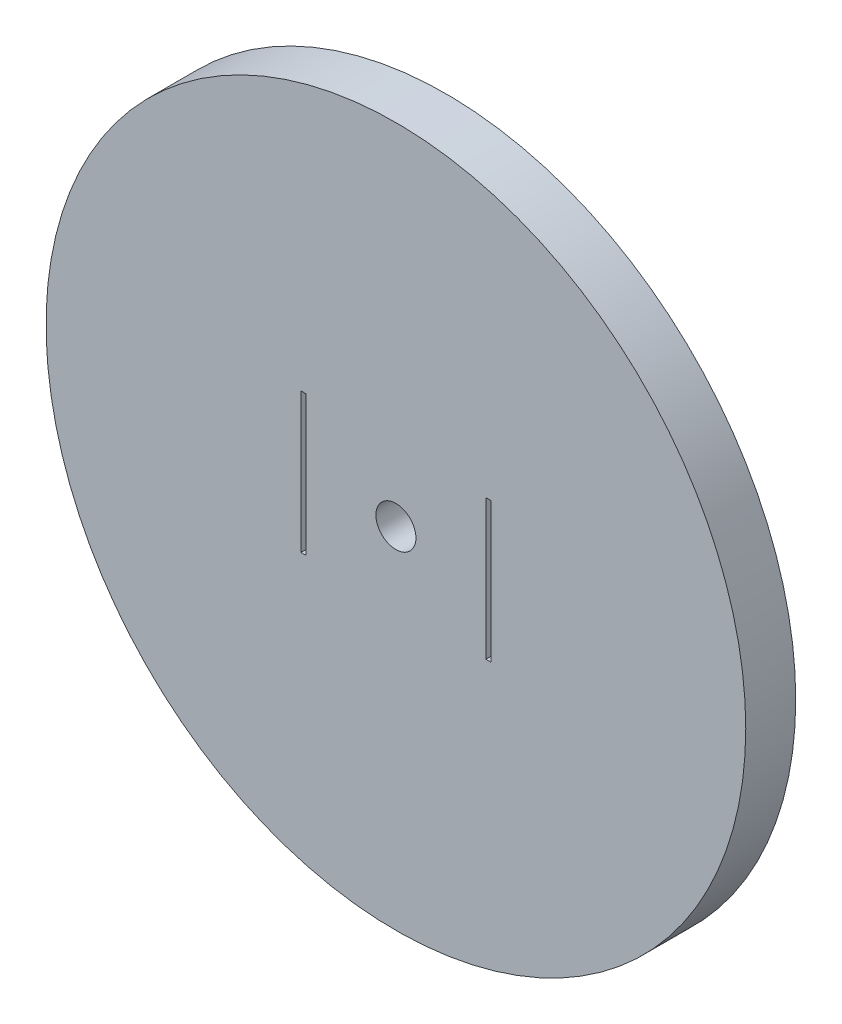
ISO-10303-21;
HEADER;
FILE_DESCRIPTION(('STEP AP214'),'2;1');
FILE_NAME('part.step','',(''),(''),'','','');
FILE_SCHEMA(('AUTOMOTIVE_DESIGN { 1 0 10303 214 1 1 1 1 }'));
ENDSEC;
DATA;
#1=APPLICATION_CONTEXT('core data for automotive mechanical design processes');
#2=APPLICATION_PROTOCOL_DEFINITION('international standard','automotive_design',2000,#1);
#3=PRODUCT_CONTEXT('',#1,'mechanical');
#4=PRODUCT('Part','Part','',(#3));
#5=PRODUCT_RELATED_PRODUCT_CATEGORY('part','',(#4));
#6=PRODUCT_DEFINITION_FORMATION('','',#4);
#7=PRODUCT_DEFINITION_CONTEXT('part definition',#1,'design');
#8=PRODUCT_DEFINITION('design','',#6,#7);
#9=PRODUCT_DEFINITION_SHAPE('','',#8);
#10=(LENGTH_UNIT() NAMED_UNIT(*) SI_UNIT(.MILLI.,.METRE.));
#11=(NAMED_UNIT(*) PLANE_ANGLE_UNIT() SI_UNIT($,.RADIAN.));
#12=(NAMED_UNIT(*) SI_UNIT($,.STERADIAN.) SOLID_ANGLE_UNIT());
#13=UNCERTAINTY_MEASURE_WITH_UNIT(LENGTH_MEASURE(1.E-05),#10,'distance_accuracy_value','');
#14=(GEOMETRIC_REPRESENTATION_CONTEXT(3) GLOBAL_UNCERTAINTY_ASSIGNED_CONTEXT((#13)) GLOBAL_UNIT_ASSIGNED_CONTEXT((#10,
#11,#12)) REPRESENTATION_CONTEXT('',''));
#15=CARTESIAN_POINT('',(0.,0.,0.));
#16=DIRECTION('',(0.,0.,1.));
#17=DIRECTION('',(1.,0.,0.));
#18=AXIS2_PLACEMENT_3D('',#15,#16,#17);
#19=CARTESIAN_POINT('',(0.,0.,5.));
#20=DIRECTION('',(0.,0.,1.));
#21=DIRECTION('',(1.,0.,0.));
#22=AXIS2_PLACEMENT_3D('',#19,#20,#21);
#23=PLANE('',#22);
#24=CARTESIAN_POINT('',(0.,0.,5.));
#25=DIRECTION('',(0.,0.,1.));
#26=DIRECTION('',(1.,0.,0.));
#27=AXIS2_PLACEMENT_3D('',#24,#25,#26);
#28=CIRCLE('',#27,35.);
#29=CARTESIAN_POINT('',(35.,0.,5.));
#30=VERTEX_POINT('',#29);
#31=EDGE_CURVE('E42',#30,#30,#28,.T.);
#32=ORIENTED_EDGE('',*,*,#31,.T.);
#33=EDGE_LOOP('',(#32));
#34=FACE_BOUND('',#33,.T.);
#35=CARTESIAN_POINT('',(0.,0.,5.));
#36=DIRECTION('',(0.,0.,1.));
#37=DIRECTION('',(1.,0.,0.));
#38=AXIS2_PLACEMENT_3D('',#35,#36,#37);
#39=CIRCLE('',#38,2.);
#40=CARTESIAN_POINT('',(2.,0.,5.));
#41=VERTEX_POINT('',#40);
#42=EDGE_CURVE('E168',#41,#41,#39,.T.);
#43=ORIENTED_EDGE('',*,*,#42,.F.);
#44=EDGE_LOOP('',(#43));
#45=FACE_BOUND('',#44,.T.);
#46=DIRECTION('',(1.,0.,0.));
#47=VECTOR('',#46,1.);
#48=CARTESIAN_POINT('',(-9.5,-7.,5.));
#49=LINE('',#48,#47);
#50=CARTESIAN_POINT('',(-9.5,-7.,5.));
#51=VERTEX_POINT('',#50);
#52=CARTESIAN_POINT('',(-9.,-7.,5.));
#53=VERTEX_POINT('',#52);
#54=EDGE_CURVE('E139',#51,#53,#49,.T.);
#55=ORIENTED_EDGE('',*,*,#54,.F.);
#56=DIRECTION('',(0.,-1.,0.));
#57=VECTOR('',#56,1.);
#58=CARTESIAN_POINT('',(-9.5,7.,5.));
#59=LINE('',#58,#57);
#60=CARTESIAN_POINT('',(-9.5,7.,5.));
#61=VERTEX_POINT('',#60);
#62=EDGE_CURVE('E137',#61,#51,#59,.T.);
#63=ORIENTED_EDGE('',*,*,#62,.F.);
#64=DIRECTION('',(-1.,0.,0.));
#65=VECTOR('',#64,1.);
#66=CARTESIAN_POINT('',(-9.5,7.,5.));
#67=LINE('',#66,#65);
#68=CARTESIAN_POINT('',(-9.,7.,5.));
#69=VERTEX_POINT('',#68);
#70=EDGE_CURVE('E145',#69,#61,#67,.T.);
#71=ORIENTED_EDGE('',*,*,#70,.F.);
#72=DIRECTION('',(0.,1.,0.));
#73=VECTOR('',#72,1.);
#74=CARTESIAN_POINT('',(-9.,7.,5.));
#75=LINE('',#74,#73);
#76=EDGE_CURVE('E142',#53,#69,#75,.T.);
#77=ORIENTED_EDGE('',*,*,#76,.F.);
#78=EDGE_LOOP('',(#55,#63,#71,#77));
#79=FACE_BOUND('',#78,.T.);
#80=DIRECTION('',(0.,-1.,0.));
#81=VECTOR('',#80,1.);
#82=CARTESIAN_POINT('',(9.,7.,5.));
#83=LINE('',#82,#81);
#84=CARTESIAN_POINT('',(9.,7.,5.));
#85=VERTEX_POINT('',#84);
#86=CARTESIAN_POINT('',(9.,-7.,5.));
#87=VERTEX_POINT('',#86);
#88=EDGE_CURVE('E108',#85,#87,#83,.T.);
#89=ORIENTED_EDGE('',*,*,#88,.F.);
#90=DIRECTION('',(-1.,0.,0.));
#91=VECTOR('',#90,1.);
#92=CARTESIAN_POINT('',(9.5,7.,5.));
#93=LINE('',#92,#91);
#94=CARTESIAN_POINT('',(9.5,7.,5.));
#95=VERTEX_POINT('',#94);
#96=EDGE_CURVE('E100',#95,#85,#93,.T.);
#97=ORIENTED_EDGE('',*,*,#96,.F.);
#98=DIRECTION('',(0.,1.,0.));
#99=VECTOR('',#98,1.);
#100=CARTESIAN_POINT('',(9.5,7.,5.));
#101=LINE('',#100,#99);
#102=CARTESIAN_POINT('',(9.5,-7.,5.));
#103=VERTEX_POINT('',#102);
#104=EDGE_CURVE('E122',#103,#95,#101,.T.);
#105=ORIENTED_EDGE('',*,*,#104,.F.);
#106=DIRECTION('',(1.,0.,0.));
#107=VECTOR('',#106,1.);
#108=CARTESIAN_POINT('',(9.5,-7.,5.));
#109=LINE('',#108,#107);
#110=EDGE_CURVE('E120',#87,#103,#109,.T.);
#111=ORIENTED_EDGE('',*,*,#110,.F.);
#112=EDGE_LOOP('',(#89,#97,#105,#111));
#113=FACE_BOUND('',#112,.T.);
#114=ADVANCED_FACE('F33',(#34,#45,#79,#113),#23,.T.);
#115=CARTESIAN_POINT('',(0.,0.,0.));
#116=DIRECTION('',(0.,0.,1.));
#117=DIRECTION('',(1.,0.,0.));
#118=AXIS2_PLACEMENT_3D('',#115,#116,#117);
#119=PLANE('',#118);
#120=CARTESIAN_POINT('',(-28.,0.,0.));
#121=DIRECTION('',(0.,0.,-1.));
#122=DIRECTION('',(-1.,0.,0.));
#123=AXIS2_PLACEMENT_3D('',#120,#121,#122);
#124=CIRCLE('',#123,4.34999999999999);
#125=CARTESIAN_POINT('',(-32.35,0.,0.));
#126=VERTEX_POINT('',#125);
#127=EDGE_CURVE('E11',#126,#126,#124,.T.);
#128=ORIENTED_EDGE('',*,*,#127,.F.);
#129=EDGE_LOOP('',(#128));
#130=FACE_BOUND('',#129,.T.);
#131=DIRECTION('',(0.,-1.,0.));
#132=VECTOR('',#131,1.);
#133=CARTESIAN_POINT('',(-9.5,7.,0.));
#134=LINE('',#133,#132);
#135=CARTESIAN_POINT('',(-9.5,7.,0.));
#136=VERTEX_POINT('',#135);
#137=CARTESIAN_POINT('',(-9.5,-7.,0.));
#138=VERTEX_POINT('',#137);
#139=EDGE_CURVE('E116',#136,#138,#134,.T.);
#140=ORIENTED_EDGE('',*,*,#139,.T.);
#141=DIRECTION('',(1.,0.,0.));
#142=VECTOR('',#141,1.);
#143=CARTESIAN_POINT('',(-9.5,-7.,0.));
#144=LINE('',#143,#142);
#145=CARTESIAN_POINT('',(-9.,-7.,0.));
#146=VERTEX_POINT('',#145);
#147=EDGE_CURVE('E150',#138,#146,#144,.T.);
#148=ORIENTED_EDGE('',*,*,#147,.T.);
#149=DIRECTION('',(0.,1.,0.));
#150=VECTOR('',#149,1.);
#151=CARTESIAN_POINT('',(-9.,7.,0.));
#152=LINE('',#151,#150);
#153=CARTESIAN_POINT('',(-9.,7.,0.));
#154=VERTEX_POINT('',#153);
#155=EDGE_CURVE('E153',#146,#154,#152,.T.);
#156=ORIENTED_EDGE('',*,*,#155,.T.);
#157=DIRECTION('',(-1.,0.,0.));
#158=VECTOR('',#157,1.);
#159=CARTESIAN_POINT('',(-9.5,7.,0.));
#160=LINE('',#159,#158);
#161=EDGE_CURVE('E140',#154,#136,#160,.T.);
#162=ORIENTED_EDGE('',*,*,#161,.T.);
#163=EDGE_LOOP('',(#140,#148,#156,#162));
#164=FACE_BOUND('',#163,.T.);
#165=CARTESIAN_POINT('',(0.,0.,0.));
#166=DIRECTION('',(0.,0.,1.));
#167=DIRECTION('',(1.,0.,0.));
#168=AXIS2_PLACEMENT_3D('',#165,#166,#167);
#169=CIRCLE('',#168,35.);
#170=CARTESIAN_POINT('',(35.,0.,0.));
#171=VERTEX_POINT('',#170);
#172=EDGE_CURVE('E37',#171,#171,#169,.T.);
#173=ORIENTED_EDGE('',*,*,#172,.F.);
#174=EDGE_LOOP('',(#173));
#175=FACE_BOUND('',#174,.T.);
#176=CARTESIAN_POINT('',(0.,0.,0.));
#177=DIRECTION('',(0.,0.,1.));
#178=DIRECTION('',(1.,0.,0.));
#179=AXIS2_PLACEMENT_3D('',#176,#177,#178);
#180=CIRCLE('',#179,2.);
#181=CARTESIAN_POINT('',(2.,0.,0.));
#182=VERTEX_POINT('',#181);
#183=EDGE_CURVE('E167',#182,#182,#180,.T.);
#184=ORIENTED_EDGE('',*,*,#183,.T.);
#185=EDGE_LOOP('',(#184));
#186=FACE_BOUND('',#185,.T.);
#187=DIRECTION('',(-1.,0.,0.));
#188=VECTOR('',#187,1.);
#189=CARTESIAN_POINT('',(9.5,7.,0.));
#190=LINE('',#189,#188);
#191=CARTESIAN_POINT('',(9.5,7.,0.));
#192=VERTEX_POINT('',#191);
#193=CARTESIAN_POINT('',(9.,7.,0.));
#194=VERTEX_POINT('',#193);
#195=EDGE_CURVE('E58',#192,#194,#190,.T.);
#196=ORIENTED_EDGE('',*,*,#195,.T.);
#197=DIRECTION('',(0.,-1.,0.));
#198=VECTOR('',#197,1.);
#199=CARTESIAN_POINT('',(9.,7.,0.));
#200=LINE('',#199,#198);
#201=CARTESIAN_POINT('',(9.,-7.,0.));
#202=VERTEX_POINT('',#201);
#203=EDGE_CURVE('E115',#194,#202,#200,.T.);
#204=ORIENTED_EDGE('',*,*,#203,.T.);
#205=DIRECTION('',(1.,0.,0.));
#206=VECTOR('',#205,1.);
#207=CARTESIAN_POINT('',(9.5,-7.,0.));
#208=LINE('',#207,#206);
#209=CARTESIAN_POINT('',(9.5,-7.,0.));
#210=VERTEX_POINT('',#209);
#211=EDGE_CURVE('E129',#202,#210,#208,.T.);
#212=ORIENTED_EDGE('',*,*,#211,.T.);
#213=DIRECTION('',(0.,1.,0.));
#214=VECTOR('',#213,1.);
#215=CARTESIAN_POINT('',(9.5,7.,0.));
#216=LINE('',#215,#214);
#217=EDGE_CURVE('E109',#210,#192,#216,.T.);
#218=ORIENTED_EDGE('',*,*,#217,.T.);
#219=EDGE_LOOP('',(#196,#204,#212,#218));
#220=FACE_BOUND('',#219,.T.);
#221=ADVANCED_FACE('F179',(#130,#164,#175,#186,#220),#119,.F.);
#222=CARTESIAN_POINT('',(0.,0.,5.));
#223=DIRECTION('',(0.,0.,-1.));
#224=DIRECTION('',(-1.,0.,0.));
#225=AXIS2_PLACEMENT_3D('',#222,#223,#224);
#226=CYLINDRICAL_SURFACE('',#225,35.);
#227=ORIENTED_EDGE('',*,*,#31,.F.);
#228=EDGE_LOOP('',(#227));
#229=FACE_BOUND('',#228,.T.);
#230=ORIENTED_EDGE('',*,*,#172,.T.);
#231=EDGE_LOOP('',(#230));
#232=FACE_BOUND('',#231,.T.);
#233=ADVANCED_FACE('F35',(#229,#232),#226,.T.);
#234=CARTESIAN_POINT('',(0.,0.,5.));
#235=DIRECTION('',(0.,0.,-1.));
#236=DIRECTION('',(-1.,0.,0.));
#237=AXIS2_PLACEMENT_3D('',#234,#235,#236);
#238=CYLINDRICAL_SURFACE('',#237,2.);
#239=ORIENTED_EDGE('',*,*,#42,.T.);
#240=EDGE_LOOP('',(#239));
#241=FACE_BOUND('',#240,.T.);
#242=ORIENTED_EDGE('',*,*,#183,.F.);
#243=EDGE_LOOP('',(#242));
#244=FACE_BOUND('',#243,.T.);
#245=ADVANCED_FACE('F206',(#241,#244),#238,.F.);
#246=CARTESIAN_POINT('',(-9.5,7.,5.));
#247=DIRECTION('',(1.,0.,0.));
#248=DIRECTION('',(0.,1.,0.));
#249=AXIS2_PLACEMENT_3D('',#246,#247,#248);
#250=PLANE('',#249);
#251=ORIENTED_EDGE('',*,*,#139,.F.);
#252=DIRECTION('',(0.,0.,-1.));
#253=VECTOR('',#252,1.);
#254=CARTESIAN_POINT('',(-9.5,7.,5.));
#255=LINE('',#254,#253);
#256=EDGE_CURVE('E147',#61,#136,#255,.T.);
#257=ORIENTED_EDGE('',*,*,#256,.F.);
#258=ORIENTED_EDGE('',*,*,#62,.T.);
#259=DIRECTION('',(0.,0.,-1.));
#260=VECTOR('',#259,1.);
#261=CARTESIAN_POINT('',(-9.5,-7.,5.));
#262=LINE('',#261,#260);
#263=EDGE_CURVE('E164',#51,#138,#262,.T.);
#264=ORIENTED_EDGE('',*,*,#263,.T.);
#265=EDGE_LOOP('',(#251,#257,#258,#264));
#266=FACE_BOUND('',#265,.T.);
#267=ADVANCED_FACE('F209',(#266),#250,.T.);
#268=CARTESIAN_POINT('',(-9.5,-7.,5.));
#269=DIRECTION('',(0.,1.,0.));
#270=DIRECTION('',(-1.,0.,0.));
#271=AXIS2_PLACEMENT_3D('',#268,#269,#270);
#272=PLANE('',#271);
#273=ORIENTED_EDGE('',*,*,#147,.F.);
#274=ORIENTED_EDGE('',*,*,#263,.F.);
#275=ORIENTED_EDGE('',*,*,#54,.T.);
#276=DIRECTION('',(0.,0.,-1.));
#277=VECTOR('',#276,1.);
#278=CARTESIAN_POINT('',(-9.,-7.,5.));
#279=LINE('',#278,#277);
#280=EDGE_CURVE('E162',#53,#146,#279,.T.);
#281=ORIENTED_EDGE('',*,*,#280,.T.);
#282=EDGE_LOOP('',(#273,#274,#275,#281));
#283=FACE_BOUND('',#282,.T.);
#284=ADVANCED_FACE('F213',(#283),#272,.T.);
#285=CARTESIAN_POINT('',(-9.,7.,5.));
#286=DIRECTION('',(-1.,0.,0.));
#287=DIRECTION('',(0.,-1.,0.));
#288=AXIS2_PLACEMENT_3D('',#285,#286,#287);
#289=PLANE('',#288);
#290=ORIENTED_EDGE('',*,*,#155,.F.);
#291=ORIENTED_EDGE('',*,*,#280,.F.);
#292=ORIENTED_EDGE('',*,*,#76,.T.);
#293=DIRECTION('',(0.,0.,-1.));
#294=VECTOR('',#293,1.);
#295=CARTESIAN_POINT('',(-9.,7.,5.));
#296=LINE('',#295,#294);
#297=EDGE_CURVE('E160',#69,#154,#296,.T.);
#298=ORIENTED_EDGE('',*,*,#297,.T.);
#299=EDGE_LOOP('',(#290,#291,#292,#298));
#300=FACE_BOUND('',#299,.T.);
#301=ADVANCED_FACE('F217',(#300),#289,.T.);
#302=CARTESIAN_POINT('',(-9.5,7.,5.));
#303=DIRECTION('',(0.,-1.,0.));
#304=DIRECTION('',(0.,0.,-1.));
#305=AXIS2_PLACEMENT_3D('',#302,#303,#304);
#306=PLANE('',#305);
#307=ORIENTED_EDGE('',*,*,#161,.F.);
#308=ORIENTED_EDGE('',*,*,#297,.F.);
#309=ORIENTED_EDGE('',*,*,#70,.T.);
#310=ORIENTED_EDGE('',*,*,#256,.T.);
#311=EDGE_LOOP('',(#307,#308,#309,#310));
#312=FACE_BOUND('',#311,.T.);
#313=ADVANCED_FACE('F221',(#312),#306,.T.);
#314=CARTESIAN_POINT('',(9.5,7.,5.));
#315=DIRECTION('',(0.,-1.,0.));
#316=DIRECTION('',(0.,0.,-1.));
#317=AXIS2_PLACEMENT_3D('',#314,#315,#316);
#318=PLANE('',#317);
#319=ORIENTED_EDGE('',*,*,#195,.F.);
#320=DIRECTION('',(0.,0.,-1.));
#321=VECTOR('',#320,1.);
#322=CARTESIAN_POINT('',(9.5,7.,5.));
#323=LINE('',#322,#321);
#324=EDGE_CURVE('E104',#95,#192,#323,.T.);
#325=ORIENTED_EDGE('',*,*,#324,.F.);
#326=ORIENTED_EDGE('',*,*,#96,.T.);
#327=DIRECTION('',(0.,0.,-1.));
#328=VECTOR('',#327,1.);
#329=CARTESIAN_POINT('',(9.,7.,5.));
#330=LINE('',#329,#328);
#331=EDGE_CURVE('E103',#85,#194,#330,.T.);
#332=ORIENTED_EDGE('',*,*,#331,.T.);
#333=EDGE_LOOP('',(#319,#325,#326,#332));
#334=FACE_BOUND('',#333,.T.);
#335=ADVANCED_FACE('F102',(#334),#318,.T.);
#336=CARTESIAN_POINT('',(9.,7.,5.));
#337=DIRECTION('',(1.,0.,0.));
#338=DIRECTION('',(0.,1.,0.));
#339=AXIS2_PLACEMENT_3D('',#336,#337,#338);
#340=PLANE('',#339);
#341=ORIENTED_EDGE('',*,*,#203,.F.);
#342=ORIENTED_EDGE('',*,*,#331,.F.);
#343=ORIENTED_EDGE('',*,*,#88,.T.);
#344=DIRECTION('',(0.,0.,-1.));
#345=VECTOR('',#344,1.);
#346=CARTESIAN_POINT('',(9.,-7.,5.));
#347=LINE('',#346,#345);
#348=EDGE_CURVE('E117',#87,#202,#347,.T.);
#349=ORIENTED_EDGE('',*,*,#348,.T.);
#350=EDGE_LOOP('',(#341,#342,#343,#349));
#351=FACE_BOUND('',#350,.T.);
#352=ADVANCED_FACE('F112',(#351),#340,.T.);
#353=CARTESIAN_POINT('',(9.5,-7.,5.));
#354=DIRECTION('',(0.,1.,0.));
#355=DIRECTION('',(-1.,0.,0.));
#356=AXIS2_PLACEMENT_3D('',#353,#354,#355);
#357=PLANE('',#356);
#358=ORIENTED_EDGE('',*,*,#211,.F.);
#359=ORIENTED_EDGE('',*,*,#348,.F.);
#360=ORIENTED_EDGE('',*,*,#110,.T.);
#361=DIRECTION('',(0.,0.,-1.));
#362=VECTOR('',#361,1.);
#363=CARTESIAN_POINT('',(9.5,-7.,5.));
#364=LINE('',#363,#362);
#365=EDGE_CURVE('E50',#103,#210,#364,.T.);
#366=ORIENTED_EDGE('',*,*,#365,.T.);
#367=EDGE_LOOP('',(#358,#359,#360,#366));
#368=FACE_BOUND('',#367,.T.);
#369=ADVANCED_FACE('F189',(#368),#357,.T.);
#370=CARTESIAN_POINT('',(9.5,7.,5.));
#371=DIRECTION('',(-1.,0.,0.));
#372=DIRECTION('',(0.,-1.,0.));
#373=AXIS2_PLACEMENT_3D('',#370,#371,#372);
#374=PLANE('',#373);
#375=ORIENTED_EDGE('',*,*,#217,.F.);
#376=ORIENTED_EDGE('',*,*,#365,.F.);
#377=ORIENTED_EDGE('',*,*,#104,.T.);
#378=ORIENTED_EDGE('',*,*,#324,.T.);
#379=EDGE_LOOP('',(#375,#376,#377,#378));
#380=FACE_BOUND('',#379,.T.);
#381=ADVANCED_FACE('F186',(#380),#374,.T.);
#382=CARTESIAN_POINT('',(-28.,0.,-14.6320728871302));
#383=DIRECTION('',(0.,0.,-1.));
#384=DIRECTION('',(-1.,0.,0.));
#385=AXIS2_PLACEMENT_3D('',#382,#383,#384);
#386=CYLINDRICAL_SURFACE('',#385,4.35);
#387=ORIENTED_EDGE('',*,*,#127,.T.);
#388=EDGE_LOOP('',(#387));
#389=FACE_BOUND('',#388,.T.);
#390=CARTESIAN_POINT('',(-28.,0.,-14.6320728871302));
#391=DIRECTION('',(0.,0.,-1.));
#392=DIRECTION('',(-1.,0.,0.));
#393=AXIS2_PLACEMENT_3D('',#390,#391,#392);
#394=CIRCLE('',#393,4.35);
#395=CARTESIAN_POINT('',(-32.35,0.,-14.6320728871302));
#396=VERTEX_POINT('',#395);
#397=EDGE_CURVE('E127',#396,#396,#394,.T.);
#398=ORIENTED_EDGE('',*,*,#397,.F.);
#399=EDGE_LOOP('',(#398));
#400=FACE_BOUND('',#399,.T.);
#401=ADVANCED_FACE('F188',(#389,#400),#386,.T.);
#402=CARTESIAN_POINT('',(-28.,0.,-14.6320728871302));
#403=DIRECTION('',(0.,0.,-1.));
#404=DIRECTION('',(-1.,0.,0.));
#405=AXIS2_PLACEMENT_3D('',#402,#403,#404);
#406=SPHERICAL_SURFACE('',#405,4.35);
#407=ORIENTED_EDGE('',*,*,#397,.T.);
#408=EDGE_LOOP('',(#407));
#409=FACE_BOUND('',#408,.T.);
#410=ADVANCED_FACE('F195',(#409),#406,.T.);
#411=CLOSED_SHELL('',(#114,#221,#233,#245,#267,#284,#301,#313,#335,#352,#369,#381,#401,#410));
#412=MANIFOLD_SOLID_BREP('B2',#411);
#413=ADVANCED_BREP_SHAPE_REPRESENTATION('',(#18,#412),#14);
#414=SHAPE_DEFINITION_REPRESENTATION(#9,#413);
ENDSEC;
END-ISO-10303-21;
